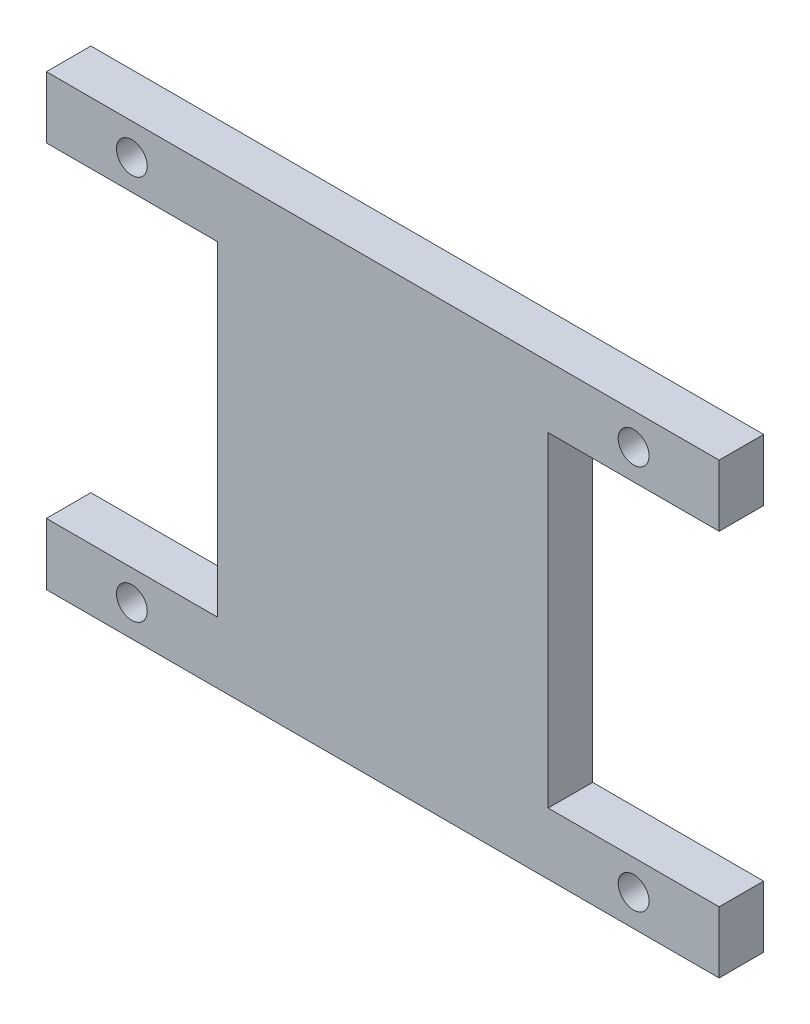
ISO-10303-21;
HEADER;
FILE_DESCRIPTION(('STEP AP214'),'2;1');
FILE_NAME('part.step','',(''),(''),'','','');
FILE_SCHEMA(('AUTOMOTIVE_DESIGN { 1 0 10303 214 1 1 1 1 }'));
ENDSEC;
DATA;
#1=APPLICATION_CONTEXT('core data for automotive mechanical design processes');
#2=APPLICATION_PROTOCOL_DEFINITION('international standard','automotive_design',2000,#1);
#3=PRODUCT_CONTEXT('',#1,'mechanical');
#4=PRODUCT('Part','Part','',(#3));
#5=PRODUCT_RELATED_PRODUCT_CATEGORY('part','',(#4));
#6=PRODUCT_DEFINITION_FORMATION('','',#4);
#7=PRODUCT_DEFINITION_CONTEXT('part definition',#1,'design');
#8=PRODUCT_DEFINITION('design','',#6,#7);
#9=PRODUCT_DEFINITION_SHAPE('','',#8);
#10=(LENGTH_UNIT() NAMED_UNIT(*) SI_UNIT(.MILLI.,.METRE.));
#11=(NAMED_UNIT(*) PLANE_ANGLE_UNIT() SI_UNIT($,.RADIAN.));
#12=(NAMED_UNIT(*) SI_UNIT($,.STERADIAN.) SOLID_ANGLE_UNIT());
#13=UNCERTAINTY_MEASURE_WITH_UNIT(LENGTH_MEASURE(1.E-05),#10,'distance_accuracy_value','');
#14=(GEOMETRIC_REPRESENTATION_CONTEXT(3) GLOBAL_UNCERTAINTY_ASSIGNED_CONTEXT((#13)) GLOBAL_UNIT_ASSIGNED_CONTEXT((#10,
#11,#12)) REPRESENTATION_CONTEXT('',''));
#15=CARTESIAN_POINT('',(0.,0.,0.));
#16=DIRECTION('',(0.,0.,1.));
#17=DIRECTION('',(1.,0.,0.));
#18=AXIS2_PLACEMENT_3D('',#15,#16,#17);
#19=CARTESIAN_POINT('',(35.8,0.,3.175));
#20=DIRECTION('',(1.,0.,0.));
#21=DIRECTION('',(0.,0.,-1.));
#22=AXIS2_PLACEMENT_3D('',#19,#20,#21);
#23=PLANE('',#22);
#24=DIRECTION('',(0.,-1.,0.));
#25=VECTOR('',#24,1.);
#26=CARTESIAN_POINT('',(35.8,0.,0.));
#27=LINE('',#26,#25);
#28=CARTESIAN_POINT('',(35.8,27.6,0.));
#29=VERTEX_POINT('',#28);
#30=CARTESIAN_POINT('',(35.8,4.4,0.));
#31=VERTEX_POINT('',#30);
#32=EDGE_CURVE('E190',#29,#31,#27,.T.);
#33=ORIENTED_EDGE('',*,*,#32,.F.);
#34=DIRECTION('',(0.,0.,-1.));
#35=VECTOR('',#34,1.);
#36=CARTESIAN_POINT('',(35.8,27.6,3.175));
#37=LINE('',#36,#35);
#38=CARTESIAN_POINT('',(35.8,27.6,3.175));
#39=VERTEX_POINT('',#38);
#40=EDGE_CURVE('E11',#39,#29,#37,.T.);
#41=ORIENTED_EDGE('',*,*,#40,.F.);
#42=DIRECTION('',(0.,-1.,0.));
#43=VECTOR('',#42,1.);
#44=CARTESIAN_POINT('',(35.8,0.,3.175));
#45=LINE('',#44,#43);
#46=CARTESIAN_POINT('',(35.8,4.4,3.175));
#47=VERTEX_POINT('',#46);
#48=EDGE_CURVE('E294',#39,#47,#45,.T.);
#49=ORIENTED_EDGE('',*,*,#48,.T.);
#50=DIRECTION('',(0.,0.,-1.));
#51=VECTOR('',#50,1.);
#52=CARTESIAN_POINT('',(35.8,4.4,3.175));
#53=LINE('',#52,#51);
#54=EDGE_CURVE('E98',#47,#31,#53,.T.);
#55=ORIENTED_EDGE('',*,*,#54,.T.);
#56=EDGE_LOOP('',(#33,#41,#49,#55));
#57=FACE_BOUND('',#56,.T.);
#58=ADVANCED_FACE('F35',(#57),#23,.T.);
#59=CARTESIAN_POINT('',(0.,27.6,3.175));
#60=DIRECTION('',(0.,-1.,0.));
#61=DIRECTION('',(0.,0.,-1.));
#62=AXIS2_PLACEMENT_3D('',#59,#60,#61);
#63=PLANE('',#62);
#64=DIRECTION('',(-1.,0.,0.));
#65=VECTOR('',#64,1.);
#66=CARTESIAN_POINT('',(0.,27.6,0.));
#67=LINE('',#66,#65);
#68=CARTESIAN_POINT('',(48.,27.6,0.));
#69=VERTEX_POINT('',#68);
#70=EDGE_CURVE('E183',#69,#29,#67,.T.);
#71=ORIENTED_EDGE('',*,*,#70,.F.);
#72=DIRECTION('',(0.,0.,-1.));
#73=VECTOR('',#72,1.);
#74=CARTESIAN_POINT('',(48.,27.6,3.175));
#75=LINE('',#74,#73);
#76=CARTESIAN_POINT('',(48.,27.6,3.175));
#77=VERTEX_POINT('',#76);
#78=EDGE_CURVE('E44',#77,#69,#75,.T.);
#79=ORIENTED_EDGE('',*,*,#78,.F.);
#80=DIRECTION('',(-1.,0.,0.));
#81=VECTOR('',#80,1.);
#82=CARTESIAN_POINT('',(0.,27.6,3.175));
#83=LINE('',#82,#81);
#84=EDGE_CURVE('E296',#77,#39,#83,.T.);
#85=ORIENTED_EDGE('',*,*,#84,.T.);
#86=ORIENTED_EDGE('',*,*,#40,.T.);
#87=EDGE_LOOP('',(#71,#79,#85,#86));
#88=FACE_BOUND('',#87,.T.);
#89=ADVANCED_FACE('F189',(#88),#63,.T.);
#90=CARTESIAN_POINT('',(48.,0.,3.175));
#91=DIRECTION('',(-1.,0.,0.));
#92=DIRECTION('',(0.,0.,1.));
#93=AXIS2_PLACEMENT_3D('',#90,#91,#92);
#94=PLANE('',#93);
#95=DIRECTION('',(0.,1.,0.));
#96=VECTOR('',#95,1.);
#97=CARTESIAN_POINT('',(48.,0.,0.));
#98=LINE('',#97,#96);
#99=CARTESIAN_POINT('',(48.,32.,0.));
#100=VERTEX_POINT('',#99);
#101=EDGE_CURVE('E175',#69,#100,#98,.T.);
#102=ORIENTED_EDGE('',*,*,#101,.T.);
#103=DIRECTION('',(0.,0.,-1.));
#104=VECTOR('',#103,1.);
#105=CARTESIAN_POINT('',(48.,32.,3.175));
#106=LINE('',#105,#104);
#107=CARTESIAN_POINT('',(48.,32.,3.175));
#108=VERTEX_POINT('',#107);
#109=EDGE_CURVE('E168',#108,#100,#106,.T.);
#110=ORIENTED_EDGE('',*,*,#109,.F.);
#111=DIRECTION('',(0.,1.,0.));
#112=VECTOR('',#111,1.);
#113=CARTESIAN_POINT('',(48.,0.,3.175));
#114=LINE('',#113,#112);
#115=EDGE_CURVE('E139',#77,#108,#114,.T.);
#116=ORIENTED_EDGE('',*,*,#115,.F.);
#117=ORIENTED_EDGE('',*,*,#78,.T.);
#118=EDGE_LOOP('',(#102,#110,#116,#117));
#119=FACE_BOUND('',#118,.T.);
#120=ADVANCED_FACE('F173',(#119),#94,.F.);
#121=CARTESIAN_POINT('',(0.,32.,3.175));
#122=DIRECTION('',(0.,1.,0.));
#123=DIRECTION('',(0.,0.,1.));
#124=AXIS2_PLACEMENT_3D('',#121,#122,#123);
#125=PLANE('',#124);
#126=DIRECTION('',(1.,0.,0.));
#127=VECTOR('',#126,1.);
#128=CARTESIAN_POINT('',(0.,32.,0.));
#129=LINE('',#128,#127);
#130=CARTESIAN_POINT('',(0.,32.,0.));
#131=VERTEX_POINT('',#130);
#132=EDGE_CURVE('E186',#131,#100,#129,.T.);
#133=ORIENTED_EDGE('',*,*,#132,.F.);
#134=DIRECTION('',(0.,0.,-1.));
#135=VECTOR('',#134,1.);
#136=CARTESIAN_POINT('',(0.,32.,3.175));
#137=LINE('',#136,#135);
#138=CARTESIAN_POINT('',(0.,32.,3.175));
#139=VERTEX_POINT('',#138);
#140=EDGE_CURVE('E166',#139,#131,#137,.T.);
#141=ORIENTED_EDGE('',*,*,#140,.F.);
#142=DIRECTION('',(1.,0.,0.));
#143=VECTOR('',#142,1.);
#144=CARTESIAN_POINT('',(0.,32.,3.175));
#145=LINE('',#144,#143);
#146=EDGE_CURVE('E302',#139,#108,#145,.T.);
#147=ORIENTED_EDGE('',*,*,#146,.T.);
#148=ORIENTED_EDGE('',*,*,#109,.T.);
#149=EDGE_LOOP('',(#133,#141,#147,#148));
#150=FACE_BOUND('',#149,.T.);
#151=ADVANCED_FACE('F247',(#150),#125,.T.);
#152=CARTESIAN_POINT('',(0.,0.,3.175));
#153=DIRECTION('',(-1.,0.,0.));
#154=DIRECTION('',(0.,0.,1.));
#155=AXIS2_PLACEMENT_3D('',#152,#153,#154);
#156=PLANE('',#155);
#157=DIRECTION('',(0.,1.,0.));
#158=VECTOR('',#157,1.);
#159=CARTESIAN_POINT('',(0.,0.,0.));
#160=LINE('',#159,#158);
#161=CARTESIAN_POINT('',(0.,27.6,0.));
#162=VERTEX_POINT('',#161);
#163=EDGE_CURVE('E197',#162,#131,#160,.T.);
#164=ORIENTED_EDGE('',*,*,#163,.F.);
#165=DIRECTION('',(0.,0.,-1.));
#166=VECTOR('',#165,1.);
#167=CARTESIAN_POINT('',(0.,27.6,3.175));
#168=LINE('',#167,#166);
#169=CARTESIAN_POINT('',(0.,27.6,3.175));
#170=VERTEX_POINT('',#169);
#171=EDGE_CURVE('E164',#170,#162,#168,.T.);
#172=ORIENTED_EDGE('',*,*,#171,.F.);
#173=DIRECTION('',(0.,1.,0.));
#174=VECTOR('',#173,1.);
#175=CARTESIAN_POINT('',(0.,0.,3.175));
#176=LINE('',#175,#174);
#177=EDGE_CURVE('E305',#170,#139,#176,.T.);
#178=ORIENTED_EDGE('',*,*,#177,.T.);
#179=ORIENTED_EDGE('',*,*,#140,.T.);
#180=EDGE_LOOP('',(#164,#172,#178,#179));
#181=FACE_BOUND('',#180,.T.);
#182=ADVANCED_FACE('F250',(#181),#156,.T.);
#183=CARTESIAN_POINT('',(0.,27.6,3.175));
#184=DIRECTION('',(0.,1.,0.));
#185=DIRECTION('',(0.,0.,1.));
#186=AXIS2_PLACEMENT_3D('',#183,#184,#185);
#187=PLANE('',#186);
#188=DIRECTION('',(1.,0.,0.));
#189=VECTOR('',#188,1.);
#190=CARTESIAN_POINT('',(0.,27.6,0.));
#191=LINE('',#190,#189);
#192=CARTESIAN_POINT('',(12.2,27.6,0.));
#193=VERTEX_POINT('',#192);
#194=EDGE_CURVE('E199',#162,#193,#191,.T.);
#195=ORIENTED_EDGE('',*,*,#194,.T.);
#196=DIRECTION('',(0.,0.,-1.));
#197=VECTOR('',#196,1.);
#198=CARTESIAN_POINT('',(12.2,27.6,3.175));
#199=LINE('',#198,#197);
#200=CARTESIAN_POINT('',(12.2,27.6,3.175));
#201=VERTEX_POINT('',#200);
#202=EDGE_CURVE('E161',#201,#193,#199,.T.);
#203=ORIENTED_EDGE('',*,*,#202,.F.);
#204=DIRECTION('',(1.,0.,0.));
#205=VECTOR('',#204,1.);
#206=CARTESIAN_POINT('',(0.,27.6,3.175));
#207=LINE('',#206,#205);
#208=EDGE_CURVE('E308',#170,#201,#207,.T.);
#209=ORIENTED_EDGE('',*,*,#208,.F.);
#210=ORIENTED_EDGE('',*,*,#171,.T.);
#211=EDGE_LOOP('',(#195,#203,#209,#210));
#212=FACE_BOUND('',#211,.T.);
#213=ADVANCED_FACE('F252',(#212),#187,.F.);
#214=CARTESIAN_POINT('',(12.2,0.,3.175));
#215=DIRECTION('',(1.,0.,0.));
#216=DIRECTION('',(0.,1.,0.));
#217=AXIS2_PLACEMENT_3D('',#214,#215,#216);
#218=PLANE('',#217);
#219=DIRECTION('',(0.,-1.,0.));
#220=VECTOR('',#219,1.);
#221=CARTESIAN_POINT('',(12.2,0.,0.));
#222=LINE('',#221,#220);
#223=CARTESIAN_POINT('',(12.2,4.4,0.));
#224=VERTEX_POINT('',#223);
#225=EDGE_CURVE('E203',#193,#224,#222,.T.);
#226=ORIENTED_EDGE('',*,*,#225,.T.);
#227=DIRECTION('',(0.,0.,-1.));
#228=VECTOR('',#227,1.);
#229=CARTESIAN_POINT('',(12.2,4.4,3.175));
#230=LINE('',#229,#228);
#231=CARTESIAN_POINT('',(12.2,4.4,3.175));
#232=VERTEX_POINT('',#231);
#233=EDGE_CURVE('E159',#232,#224,#230,.T.);
#234=ORIENTED_EDGE('',*,*,#233,.F.);
#235=DIRECTION('',(0.,-1.,0.));
#236=VECTOR('',#235,1.);
#237=CARTESIAN_POINT('',(12.2,0.,3.175));
#238=LINE('',#237,#236);
#239=EDGE_CURVE('E311',#201,#232,#238,.T.);
#240=ORIENTED_EDGE('',*,*,#239,.F.);
#241=ORIENTED_EDGE('',*,*,#202,.T.);
#242=EDGE_LOOP('',(#226,#234,#240,#241));
#243=FACE_BOUND('',#242,.T.);
#244=ADVANCED_FACE('F255',(#243),#218,.F.);
#245=CARTESIAN_POINT('',(0.,4.4,3.175));
#246=DIRECTION('',(0.,1.,0.));
#247=DIRECTION('',(0.,0.,1.));
#248=AXIS2_PLACEMENT_3D('',#245,#246,#247);
#249=PLANE('',#248);
#250=DIRECTION('',(1.,0.,0.));
#251=VECTOR('',#250,1.);
#252=CARTESIAN_POINT('',(0.,4.4,0.));
#253=LINE('',#252,#251);
#254=CARTESIAN_POINT('',(0.,4.4,0.));
#255=VERTEX_POINT('',#254);
#256=EDGE_CURVE('E206',#255,#224,#253,.T.);
#257=ORIENTED_EDGE('',*,*,#256,.F.);
#258=DIRECTION('',(0.,0.,-1.));
#259=VECTOR('',#258,1.);
#260=CARTESIAN_POINT('',(0.,4.4,3.175));
#261=LINE('',#260,#259);
#262=CARTESIAN_POINT('',(0.,4.4,3.175));
#263=VERTEX_POINT('',#262);
#264=EDGE_CURVE('E153',#263,#255,#261,.T.);
#265=ORIENTED_EDGE('',*,*,#264,.F.);
#266=DIRECTION('',(1.,0.,0.));
#267=VECTOR('',#266,1.);
#268=CARTESIAN_POINT('',(0.,4.4,3.175));
#269=LINE('',#268,#267);
#270=EDGE_CURVE('E312',#263,#232,#269,.T.);
#271=ORIENTED_EDGE('',*,*,#270,.T.);
#272=ORIENTED_EDGE('',*,*,#233,.T.);
#273=EDGE_LOOP('',(#257,#265,#271,#272));
#274=FACE_BOUND('',#273,.T.);
#275=ADVANCED_FACE('F259',(#274),#249,.T.);
#276=CARTESIAN_POINT('',(0.,0.,0.));
#277=VERTEX_POINT('',#276);
#278=EDGE_CURVE('E200',#277,#255,#160,.T.);
#279=ORIENTED_EDGE('',*,*,#278,.F.);
#280=DIRECTION('',(0.,0.,-1.));
#281=VECTOR('',#280,1.);
#282=CARTESIAN_POINT('',(0.,0.,3.175));
#283=LINE('',#282,#281);
#284=CARTESIAN_POINT('',(0.,0.,3.175));
#285=VERTEX_POINT('',#284);
#286=EDGE_CURVE('E151',#285,#277,#283,.T.);
#287=ORIENTED_EDGE('',*,*,#286,.F.);
#288=EDGE_CURVE('E145',#285,#263,#176,.T.);
#289=ORIENTED_EDGE('',*,*,#288,.T.);
#290=ORIENTED_EDGE('',*,*,#264,.T.);
#291=EDGE_LOOP('',(#279,#287,#289,#290));
#292=FACE_BOUND('',#291,.T.);
#293=ADVANCED_FACE('F263',(#292),#156,.T.);
#294=CARTESIAN_POINT('',(0.,0.,3.175));
#295=DIRECTION('',(0.,1.,0.));
#296=DIRECTION('',(0.,0.,1.));
#297=AXIS2_PLACEMENT_3D('',#294,#295,#296);
#298=PLANE('',#297);
#299=DIRECTION('',(1.,0.,0.));
#300=VECTOR('',#299,1.);
#301=CARTESIAN_POINT('',(0.,0.,0.));
#302=LINE('',#301,#300);
#303=CARTESIAN_POINT('',(48.,0.,0.));
#304=VERTEX_POINT('',#303);
#305=EDGE_CURVE('E150',#277,#304,#302,.T.);
#306=ORIENTED_EDGE('',*,*,#305,.T.);
#307=DIRECTION('',(0.,0.,-1.));
#308=VECTOR('',#307,1.);
#309=CARTESIAN_POINT('',(48.,0.,3.175));
#310=LINE('',#309,#308);
#311=CARTESIAN_POINT('',(48.,0.,3.175));
#312=VERTEX_POINT('',#311);
#313=EDGE_CURVE('E134',#312,#304,#310,.T.);
#314=ORIENTED_EDGE('',*,*,#313,.F.);
#315=DIRECTION('',(1.,0.,0.));
#316=VECTOR('',#315,1.);
#317=CARTESIAN_POINT('',(0.,0.,3.175));
#318=LINE('',#317,#316);
#319=EDGE_CURVE('E137',#285,#312,#318,.T.);
#320=ORIENTED_EDGE('',*,*,#319,.F.);
#321=ORIENTED_EDGE('',*,*,#286,.T.);
#322=EDGE_LOOP('',(#306,#314,#320,#321));
#323=FACE_BOUND('',#322,.T.);
#324=ADVANCED_FACE('F148',(#323),#298,.F.);
#325=CARTESIAN_POINT('',(48.,4.4,0.));
#326=VERTEX_POINT('',#325);
#327=EDGE_CURVE('E188',#304,#326,#98,.T.);
#328=ORIENTED_EDGE('',*,*,#327,.T.);
#329=DIRECTION('',(0.,0.,-1.));
#330=VECTOR('',#329,1.);
#331=CARTESIAN_POINT('',(48.,4.4,3.175));
#332=LINE('',#331,#330);
#333=CARTESIAN_POINT('',(48.,4.4,3.175));
#334=VERTEX_POINT('',#333);
#335=EDGE_CURVE('E136',#334,#326,#332,.T.);
#336=ORIENTED_EDGE('',*,*,#335,.F.);
#337=EDGE_CURVE('E129',#312,#334,#114,.T.);
#338=ORIENTED_EDGE('',*,*,#337,.F.);
#339=ORIENTED_EDGE('',*,*,#313,.T.);
#340=EDGE_LOOP('',(#328,#336,#338,#339));
#341=FACE_BOUND('',#340,.T.);
#342=ADVANCED_FACE('F132',(#341),#94,.F.);
#343=CARTESIAN_POINT('',(6.1,29.75,3.175));
#344=DIRECTION('',(0.,0.,-1.));
#345=DIRECTION('',(-1.,0.,0.));
#346=AXIS2_PLACEMENT_3D('',#343,#344,#345);
#347=CYLINDRICAL_SURFACE('',#346,1.1);
#348=CARTESIAN_POINT('',(6.1,29.75,3.175));
#349=DIRECTION('',(0.,0.,1.));
#350=DIRECTION('',(1.,0.,0.));
#351=AXIS2_PLACEMENT_3D('',#348,#349,#350);
#352=CIRCLE('',#351,1.1);
#353=CARTESIAN_POINT('',(7.2,29.75,3.175));
#354=VERTEX_POINT('',#353);
#355=EDGE_CURVE('E293',#354,#354,#352,.T.);
#356=ORIENTED_EDGE('',*,*,#355,.T.);
#357=EDGE_LOOP('',(#356));
#358=FACE_BOUND('',#357,.T.);
#359=CARTESIAN_POINT('',(6.1,29.75,0.));
#360=DIRECTION('',(0.,0.,1.));
#361=DIRECTION('',(1.,0.,0.));
#362=AXIS2_PLACEMENT_3D('',#359,#360,#361);
#363=CIRCLE('',#362,1.1);
#364=CARTESIAN_POINT('',(7.2,29.75,0.));
#365=VERTEX_POINT('',#364);
#366=EDGE_CURVE('E192',#365,#365,#363,.T.);
#367=ORIENTED_EDGE('',*,*,#366,.F.);
#368=EDGE_LOOP('',(#367));
#369=FACE_BOUND('',#368,.T.);
#370=ADVANCED_FACE('F226',(#358,#369),#347,.F.);
#371=CARTESIAN_POINT('',(6.1,2.25,3.175));
#372=DIRECTION('',(0.,0.,-1.));
#373=DIRECTION('',(-1.,0.,0.));
#374=AXIS2_PLACEMENT_3D('',#371,#372,#373);
#375=CYLINDRICAL_SURFACE('',#374,1.1);
#376=CARTESIAN_POINT('',(6.1,2.25,3.175));
#377=DIRECTION('',(0.,0.,1.));
#378=DIRECTION('',(1.,0.,0.));
#379=AXIS2_PLACEMENT_3D('',#376,#377,#378);
#380=CIRCLE('',#379,1.1);
#381=CARTESIAN_POINT('',(7.2,2.25,3.175));
#382=VERTEX_POINT('',#381);
#383=EDGE_CURVE('E291',#382,#382,#380,.T.);
#384=ORIENTED_EDGE('',*,*,#383,.T.);
#385=EDGE_LOOP('',(#384));
#386=FACE_BOUND('',#385,.T.);
#387=CARTESIAN_POINT('',(6.1,2.25,0.));
#388=DIRECTION('',(0.,0.,1.));
#389=DIRECTION('',(1.,0.,0.));
#390=AXIS2_PLACEMENT_3D('',#387,#388,#389);
#391=CIRCLE('',#390,1.1);
#392=CARTESIAN_POINT('',(7.2,2.25,0.));
#393=VERTEX_POINT('',#392);
#394=EDGE_CURVE('E220',#393,#393,#391,.T.);
#395=ORIENTED_EDGE('',*,*,#394,.F.);
#396=EDGE_LOOP('',(#395));
#397=FACE_BOUND('',#396,.T.);
#398=ADVANCED_FACE('F228',(#386,#397),#375,.F.);
#399=CARTESIAN_POINT('',(41.9,29.75,3.175));
#400=DIRECTION('',(0.,0.,-1.));
#401=DIRECTION('',(-1.,0.,0.));
#402=AXIS2_PLACEMENT_3D('',#399,#400,#401);
#403=CYLINDRICAL_SURFACE('',#402,1.1);
#404=CARTESIAN_POINT('',(41.9,29.75,3.175));
#405=DIRECTION('',(0.,0.,1.));
#406=DIRECTION('',(1.,0.,0.));
#407=AXIS2_PLACEMENT_3D('',#404,#405,#406);
#408=CIRCLE('',#407,1.1);
#409=CARTESIAN_POINT('',(43.,29.75,3.175));
#410=VERTEX_POINT('',#409);
#411=EDGE_CURVE('E287',#410,#410,#408,.T.);
#412=ORIENTED_EDGE('',*,*,#411,.T.);
#413=EDGE_LOOP('',(#412));
#414=FACE_BOUND('',#413,.T.);
#415=CARTESIAN_POINT('',(41.9,29.75,0.));
#416=DIRECTION('',(0.,0.,1.));
#417=DIRECTION('',(1.,0.,0.));
#418=AXIS2_PLACEMENT_3D('',#415,#416,#417);
#419=CIRCLE('',#418,1.1);
#420=CARTESIAN_POINT('',(43.,29.75,0.));
#421=VERTEX_POINT('',#420);
#422=EDGE_CURVE('E217',#421,#421,#419,.T.);
#423=ORIENTED_EDGE('',*,*,#422,.F.);
#424=EDGE_LOOP('',(#423));
#425=FACE_BOUND('',#424,.T.);
#426=ADVANCED_FACE('F235',(#414,#425),#403,.F.);
#427=CARTESIAN_POINT('',(41.9,2.25,3.175));
#428=DIRECTION('',(0.,0.,-1.));
#429=DIRECTION('',(-1.,0.,0.));
#430=AXIS2_PLACEMENT_3D('',#427,#428,#429);
#431=CYLINDRICAL_SURFACE('',#430,1.1);
#432=CARTESIAN_POINT('',(41.9,2.25,3.175));
#433=DIRECTION('',(0.,0.,1.));
#434=DIRECTION('',(1.,0.,0.));
#435=AXIS2_PLACEMENT_3D('',#432,#433,#434);
#436=CIRCLE('',#435,1.1);
#437=CARTESIAN_POINT('',(43.,2.25,3.175));
#438=VERTEX_POINT('',#437);
#439=EDGE_CURVE('E210',#438,#438,#436,.T.);
#440=ORIENTED_EDGE('',*,*,#439,.T.);
#441=EDGE_LOOP('',(#440));
#442=FACE_BOUND('',#441,.T.);
#443=CARTESIAN_POINT('',(41.9,2.25,0.));
#444=DIRECTION('',(0.,0.,1.));
#445=DIRECTION('',(1.,0.,0.));
#446=AXIS2_PLACEMENT_3D('',#443,#444,#445);
#447=CIRCLE('',#446,1.1);
#448=CARTESIAN_POINT('',(43.,2.25,0.));
#449=VERTEX_POINT('',#448);
#450=EDGE_CURVE('E214',#449,#449,#447,.T.);
#451=ORIENTED_EDGE('',*,*,#450,.F.);
#452=EDGE_LOOP('',(#451));
#453=FACE_BOUND('',#452,.T.);
#454=ADVANCED_FACE('F37',(#442,#453),#431,.F.);
#455=CARTESIAN_POINT('',(0.,4.4,3.175));
#456=DIRECTION('',(0.,-1.,0.));
#457=DIRECTION('',(1.,0.,0.));
#458=AXIS2_PLACEMENT_3D('',#455,#456,#457);
#459=PLANE('',#458);
#460=DIRECTION('',(-1.,0.,0.));
#461=VECTOR('',#460,1.);
#462=CARTESIAN_POINT('',(0.,4.4,0.));
#463=LINE('',#462,#461);
#464=EDGE_CURVE('E91',#326,#31,#463,.T.);
#465=ORIENTED_EDGE('',*,*,#464,.T.);
#466=ORIENTED_EDGE('',*,*,#54,.F.);
#467=DIRECTION('',(-1.,0.,0.));
#468=VECTOR('',#467,1.);
#469=CARTESIAN_POINT('',(0.,4.4,3.175));
#470=LINE('',#469,#468);
#471=EDGE_CURVE('E52',#334,#47,#470,.T.);
#472=ORIENTED_EDGE('',*,*,#471,.F.);
#473=ORIENTED_EDGE('',*,*,#335,.T.);
#474=EDGE_LOOP('',(#465,#466,#472,#473));
#475=FACE_BOUND('',#474,.T.);
#476=ADVANCED_FACE('F270',(#475),#459,.F.);
#477=CARTESIAN_POINT('',(0.,0.,3.175));
#478=DIRECTION('',(0.,0.,1.));
#479=DIRECTION('',(1.,0.,0.));
#480=AXIS2_PLACEMENT_3D('',#477,#478,#479);
#481=PLANE('',#480);
#482=ORIENTED_EDGE('',*,*,#439,.F.);
#483=EDGE_LOOP('',(#482));
#484=FACE_BOUND('',#483,.T.);
#485=ORIENTED_EDGE('',*,*,#411,.F.);
#486=EDGE_LOOP('',(#485));
#487=FACE_BOUND('',#486,.T.);
#488=ORIENTED_EDGE('',*,*,#383,.F.);
#489=EDGE_LOOP('',(#488));
#490=FACE_BOUND('',#489,.T.);
#491=ORIENTED_EDGE('',*,*,#355,.F.);
#492=EDGE_LOOP('',(#491));
#493=FACE_BOUND('',#492,.T.);
#494=ORIENTED_EDGE('',*,*,#48,.F.);
#495=ORIENTED_EDGE('',*,*,#84,.F.);
#496=ORIENTED_EDGE('',*,*,#115,.T.);
#497=ORIENTED_EDGE('',*,*,#146,.F.);
#498=ORIENTED_EDGE('',*,*,#177,.F.);
#499=ORIENTED_EDGE('',*,*,#208,.T.);
#500=ORIENTED_EDGE('',*,*,#239,.T.);
#501=ORIENTED_EDGE('',*,*,#270,.F.);
#502=ORIENTED_EDGE('',*,*,#288,.F.);
#503=ORIENTED_EDGE('',*,*,#319,.T.);
#504=ORIENTED_EDGE('',*,*,#337,.T.);
#505=ORIENTED_EDGE('',*,*,#471,.T.);
#506=EDGE_LOOP('',(#494,#495,#496,#497,#498,#499,#500,#501,#502,#503,#504,#505));
#507=FACE_BOUND('',#506,.T.);
#508=ADVANCED_FACE('F142',(#484,#487,#490,#493,#507),#481,.T.);
#509=CARTESIAN_POINT('',(0.,0.,0.));
#510=DIRECTION('',(0.,0.,1.));
#511=DIRECTION('',(1.,0.,0.));
#512=AXIS2_PLACEMENT_3D('',#509,#510,#511);
#513=PLANE('',#512);
#514=ORIENTED_EDGE('',*,*,#450,.T.);
#515=EDGE_LOOP('',(#514));
#516=FACE_BOUND('',#515,.T.);
#517=ORIENTED_EDGE('',*,*,#422,.T.);
#518=EDGE_LOOP('',(#517));
#519=FACE_BOUND('',#518,.T.);
#520=ORIENTED_EDGE('',*,*,#394,.T.);
#521=EDGE_LOOP('',(#520));
#522=FACE_BOUND('',#521,.T.);
#523=ORIENTED_EDGE('',*,*,#366,.T.);
#524=EDGE_LOOP('',(#523));
#525=FACE_BOUND('',#524,.T.);
#526=ORIENTED_EDGE('',*,*,#32,.T.);
#527=ORIENTED_EDGE('',*,*,#464,.F.);
#528=ORIENTED_EDGE('',*,*,#327,.F.);
#529=ORIENTED_EDGE('',*,*,#305,.F.);
#530=ORIENTED_EDGE('',*,*,#278,.T.);
#531=ORIENTED_EDGE('',*,*,#256,.T.);
#532=ORIENTED_EDGE('',*,*,#225,.F.);
#533=ORIENTED_EDGE('',*,*,#194,.F.);
#534=ORIENTED_EDGE('',*,*,#163,.T.);
#535=ORIENTED_EDGE('',*,*,#132,.T.);
#536=ORIENTED_EDGE('',*,*,#101,.F.);
#537=ORIENTED_EDGE('',*,*,#70,.T.);
#538=EDGE_LOOP('',(#526,#527,#528,#529,#530,#531,#532,#533,#534,#535,#536,#537));
#539=FACE_BOUND('',#538,.T.);
#540=ADVANCED_FACE('F182',(#516,#519,#522,#525,#539),#513,.F.);
#541=CLOSED_SHELL('',(#58,#89,#120,#151,#182,#213,#244,#275,#293,#324,#342,#370,#398,#426,#454,
#476,#508,#540));
#542=MANIFOLD_SOLID_BREP('B2',#541);
#543=ADVANCED_BREP_SHAPE_REPRESENTATION('',(#18,#542),#14);
#544=SHAPE_DEFINITION_REPRESENTATION(#9,#543);
ENDSEC;
END-ISO-10303-21;
